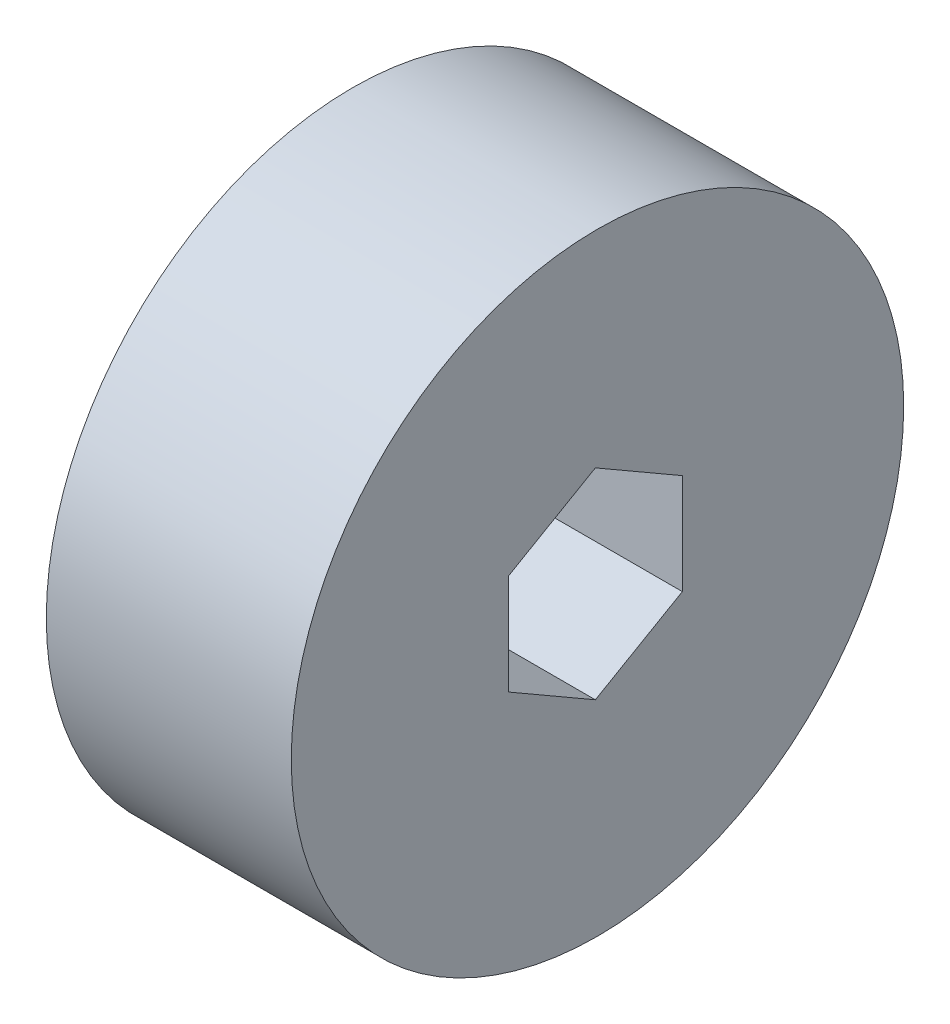
ISO-10303-21;
HEADER;
FILE_DESCRIPTION(('STEP AP214'),'2;1');
FILE_NAME('part.step','',(''),(''),'','','');
FILE_SCHEMA(('AUTOMOTIVE_DESIGN { 1 0 10303 214 1 1 1 1 }'));
ENDSEC;
DATA;
#1=APPLICATION_CONTEXT('core data for automotive mechanical design processes');
#2=APPLICATION_PROTOCOL_DEFINITION('international standard','automotive_design',2000,#1);
#3=PRODUCT_CONTEXT('',#1,'mechanical');
#4=PRODUCT('Part','Part','',(#3));
#5=PRODUCT_RELATED_PRODUCT_CATEGORY('part','',(#4));
#6=PRODUCT_DEFINITION_FORMATION('','',#4);
#7=PRODUCT_DEFINITION_CONTEXT('part definition',#1,'design');
#8=PRODUCT_DEFINITION('design','',#6,#7);
#9=PRODUCT_DEFINITION_SHAPE('','',#8);
#10=(LENGTH_UNIT() NAMED_UNIT(*) SI_UNIT(.MILLI.,.METRE.));
#11=(NAMED_UNIT(*) PLANE_ANGLE_UNIT() SI_UNIT($,.RADIAN.));
#12=(NAMED_UNIT(*) SI_UNIT($,.STERADIAN.) SOLID_ANGLE_UNIT());
#13=UNCERTAINTY_MEASURE_WITH_UNIT(LENGTH_MEASURE(1.E-05),#10,'distance_accuracy_value','');
#14=(GEOMETRIC_REPRESENTATION_CONTEXT(3) GLOBAL_UNCERTAINTY_ASSIGNED_CONTEXT((#13)) GLOBAL_UNIT_ASSIGNED_CONTEXT((#10,
#11,#12)) REPRESENTATION_CONTEXT('',''));
#15=CARTESIAN_POINT('',(0.,0.,0.));
#16=DIRECTION('',(0.,0.,1.));
#17=DIRECTION('',(1.,0.,0.));
#18=AXIS2_PLACEMENT_3D('',#15,#16,#17);
#19=CARTESIAN_POINT('',(5.,0.,0.));
#20=DIRECTION('',(1.,0.,0.));
#21=DIRECTION('',(0.,0.,-1.));
#22=AXIS2_PLACEMENT_3D('',#19,#20,#21);
#23=PLANE('',#22);
#24=CARTESIAN_POINT('',(5.,0.,0.));
#25=DIRECTION('',(1.,0.,0.));
#26=DIRECTION('',(0.,0.,-1.));
#27=AXIS2_PLACEMENT_3D('',#24,#25,#26);
#28=CIRCLE('',#27,12.5);
#29=CARTESIAN_POINT('',(5.,0.,-12.5));
#30=VERTEX_POINT('',#29);
#31=EDGE_CURVE('E11',#30,#30,#28,.T.);
#32=ORIENTED_EDGE('',*,*,#31,.T.);
#33=EDGE_LOOP('',(#32));
#34=FACE_BOUND('',#33,.T.);
#35=DIRECTION('',(0.,0.500000000000001,-0.866025403784438));
#36=VECTOR('',#35,1.);
#37=CARTESIAN_POINT('',(5.,-4.09515334538775,0.086747096681614));
#38=LINE('',#37,#36);
#39=CARTESIAN_POINT('',(5.,-4.09515334538775,0.086747096681614));
#40=VERTEX_POINT('',#39);
#41=CARTESIAN_POINT('',(5.,-2.04555988976458,-3.46325290331838));
#42=VERTEX_POINT('',#41);
#43=EDGE_CURVE('E102',#40,#42,#38,.T.);
#44=ORIENTED_EDGE('',*,*,#43,.F.);
#45=DIRECTION('',(0.,-0.5,-0.866025403784439));
#46=VECTOR('',#45,1.);
#47=CARTESIAN_POINT('',(5.,-2.04555988976458,3.63674709668161));
#48=LINE('',#47,#46);
#49=CARTESIAN_POINT('',(5.,-2.04555988976458,3.63674709668161));
#50=VERTEX_POINT('',#49);
#51=EDGE_CURVE('E93',#50,#40,#48,.T.);
#52=ORIENTED_EDGE('',*,*,#51,.F.);
#53=DIRECTION('',(0.,-1.,0.));
#54=VECTOR('',#53,1.);
#55=CARTESIAN_POINT('',(5.,2.05362702148176,3.63674709668161));
#56=LINE('',#55,#54);
#57=CARTESIAN_POINT('',(5.,2.05362702148176,3.63674709668161));
#58=VERTEX_POINT('',#57);
#59=EDGE_CURVE('E127',#58,#50,#56,.T.);
#60=ORIENTED_EDGE('',*,*,#59,.F.);
#61=DIRECTION('',(0.,-0.500000000000001,0.866025403784438));
#62=VECTOR('',#61,1.);
#63=CARTESIAN_POINT('',(5.,4.10322047710493,0.0867470966816157));
#64=LINE('',#63,#62);
#65=CARTESIAN_POINT('',(5.,4.10322047710493,0.0867470966816157));
#66=VERTEX_POINT('',#65);
#67=EDGE_CURVE('E124',#66,#58,#64,.T.);
#68=ORIENTED_EDGE('',*,*,#67,.F.);
#69=DIRECTION('',(0.,0.5,0.866025403784438));
#70=VECTOR('',#69,1.);
#71=CARTESIAN_POINT('',(5.,2.05362702148176,-3.46325290331838));
#72=LINE('',#71,#70);
#73=CARTESIAN_POINT('',(5.,2.05362702148176,-3.46325290331838));
#74=VERTEX_POINT('',#73);
#75=EDGE_CURVE('E119',#74,#66,#72,.T.);
#76=ORIENTED_EDGE('',*,*,#75,.F.);
#77=DIRECTION('',(0.,1.,0.));
#78=VECTOR('',#77,1.);
#79=CARTESIAN_POINT('',(5.,-2.04555988976458,-3.46325290331838));
#80=LINE('',#79,#78);
#81=EDGE_CURVE('E115',#42,#74,#80,.T.);
#82=ORIENTED_EDGE('',*,*,#81,.F.);
#83=EDGE_LOOP('',(#44,#52,#60,#68,#76,#82));
#84=FACE_BOUND('',#83,.T.);
#85=ADVANCED_FACE('F39',(#34,#84),#23,.T.);
#86=CARTESIAN_POINT('',(-5.,0.,0.));
#87=DIRECTION('',(1.,0.,0.));
#88=DIRECTION('',(0.,0.,-1.));
#89=AXIS2_PLACEMENT_3D('',#86,#87,#88);
#90=PLANE('',#89);
#91=CARTESIAN_POINT('',(-5.,0.,0.));
#92=DIRECTION('',(1.,0.,0.));
#93=DIRECTION('',(0.,0.,-1.));
#94=AXIS2_PLACEMENT_3D('',#91,#92,#93);
#95=CIRCLE('',#94,12.5);
#96=CARTESIAN_POINT('',(-5.,0.,-12.5));
#97=VERTEX_POINT('',#96);
#98=EDGE_CURVE('E43',#97,#97,#95,.T.);
#99=ORIENTED_EDGE('',*,*,#98,.F.);
#100=EDGE_LOOP('',(#99));
#101=FACE_BOUND('',#100,.T.);
#102=DIRECTION('',(0.,-0.5,-0.866025403784439));
#103=VECTOR('',#102,1.);
#104=CARTESIAN_POINT('',(-5.,-2.04555988976458,3.63674709668161));
#105=LINE('',#104,#103);
#106=CARTESIAN_POINT('',(-5.,-2.04555988976458,3.63674709668161));
#107=VERTEX_POINT('',#106);
#108=CARTESIAN_POINT('',(-5.,-4.09515334538775,0.086747096681614));
#109=VERTEX_POINT('',#108);
#110=EDGE_CURVE('E63',#107,#109,#105,.T.);
#111=ORIENTED_EDGE('',*,*,#110,.T.);
#112=DIRECTION('',(0.,0.500000000000001,-0.866025403784438));
#113=VECTOR('',#112,1.);
#114=CARTESIAN_POINT('',(-5.,-4.09515334538775,0.086747096681614));
#115=LINE('',#114,#113);
#116=CARTESIAN_POINT('',(-5.,-2.04555988976458,-3.46325290331838));
#117=VERTEX_POINT('',#116);
#118=EDGE_CURVE('E109',#109,#117,#115,.T.);
#119=ORIENTED_EDGE('',*,*,#118,.T.);
#120=DIRECTION('',(0.,1.,0.));
#121=VECTOR('',#120,1.);
#122=CARTESIAN_POINT('',(-5.,-2.04555988976458,-3.46325290331838));
#123=LINE('',#122,#121);
#124=CARTESIAN_POINT('',(-5.,2.05362702148176,-3.46325290331838));
#125=VERTEX_POINT('',#124);
#126=EDGE_CURVE('E134',#117,#125,#123,.T.);
#127=ORIENTED_EDGE('',*,*,#126,.T.);
#128=DIRECTION('',(0.,0.5,0.866025403784438));
#129=VECTOR('',#128,1.);
#130=CARTESIAN_POINT('',(-5.,2.05362702148176,-3.46325290331838));
#131=LINE('',#130,#129);
#132=CARTESIAN_POINT('',(-5.,4.10322047710493,0.0867470966816157));
#133=VERTEX_POINT('',#132);
#134=EDGE_CURVE('E138',#125,#133,#131,.T.);
#135=ORIENTED_EDGE('',*,*,#134,.T.);
#136=DIRECTION('',(0.,-0.500000000000001,0.866025403784438));
#137=VECTOR('',#136,1.);
#138=CARTESIAN_POINT('',(-5.,4.10322047710493,0.0867470966816157));
#139=LINE('',#138,#137);
#140=CARTESIAN_POINT('',(-5.,2.05362702148176,3.63674709668161));
#141=VERTEX_POINT('',#140);
#142=EDGE_CURVE('E142',#133,#141,#139,.T.);
#143=ORIENTED_EDGE('',*,*,#142,.T.);
#144=DIRECTION('',(0.,-1.,0.));
#145=VECTOR('',#144,1.);
#146=CARTESIAN_POINT('',(-5.,2.05362702148176,3.63674709668161));
#147=LINE('',#146,#145);
#148=EDGE_CURVE('E103',#141,#107,#147,.T.);
#149=ORIENTED_EDGE('',*,*,#148,.T.);
#150=EDGE_LOOP('',(#111,#119,#127,#135,#143,#149));
#151=FACE_BOUND('',#150,.T.);
#152=ADVANCED_FACE('F166',(#101,#151),#90,.F.);
#153=CARTESIAN_POINT('',(5.,0.,0.));
#154=DIRECTION('',(-1.,0.,0.));
#155=DIRECTION('',(0.,0.,1.));
#156=AXIS2_PLACEMENT_3D('',#153,#154,#155);
#157=CYLINDRICAL_SURFACE('',#156,12.5);
#158=ORIENTED_EDGE('',*,*,#31,.F.);
#159=EDGE_LOOP('',(#158));
#160=FACE_BOUND('',#159,.T.);
#161=ORIENTED_EDGE('',*,*,#98,.T.);
#162=EDGE_LOOP('',(#161));
#163=FACE_BOUND('',#162,.T.);
#164=ADVANCED_FACE('F41',(#160,#163),#157,.T.);
#165=CARTESIAN_POINT('',(5.,-2.04555988976458,3.63674709668161));
#166=DIRECTION('',(0.,0.866025403784439,-0.5));
#167=DIRECTION('',(0.,0.5,0.866025403784439));
#168=AXIS2_PLACEMENT_3D('',#165,#166,#167);
#169=PLANE('',#168);
#170=ORIENTED_EDGE('',*,*,#110,.F.);
#171=DIRECTION('',(-1.,0.,0.));
#172=VECTOR('',#171,1.);
#173=CARTESIAN_POINT('',(5.,-2.04555988976458,3.63674709668161));
#174=LINE('',#173,#172);
#175=EDGE_CURVE('E97',#50,#107,#174,.T.);
#176=ORIENTED_EDGE('',*,*,#175,.F.);
#177=ORIENTED_EDGE('',*,*,#51,.T.);
#178=DIRECTION('',(-1.,0.,0.));
#179=VECTOR('',#178,1.);
#180=CARTESIAN_POINT('',(5.,-4.09515334538775,0.086747096681614));
#181=LINE('',#180,#179);
#182=EDGE_CURVE('E96',#40,#109,#181,.T.);
#183=ORIENTED_EDGE('',*,*,#182,.T.);
#184=EDGE_LOOP('',(#170,#176,#177,#183));
#185=FACE_BOUND('',#184,.T.);
#186=ADVANCED_FACE('F95',(#185),#169,.T.);
#187=CARTESIAN_POINT('',(5.,-4.09515334538775,0.086747096681614));
#188=DIRECTION('',(0.,0.866025403784438,0.500000000000001));
#189=DIRECTION('',(0.,-0.500000000000001,0.866025403784438));
#190=AXIS2_PLACEMENT_3D('',#187,#188,#189);
#191=PLANE('',#190);
#192=ORIENTED_EDGE('',*,*,#118,.F.);
#193=ORIENTED_EDGE('',*,*,#182,.F.);
#194=ORIENTED_EDGE('',*,*,#43,.T.);
#195=DIRECTION('',(-1.,0.,0.));
#196=VECTOR('',#195,1.);
#197=CARTESIAN_POINT('',(5.,-2.04555988976458,-3.46325290331838));
#198=LINE('',#197,#196);
#199=EDGE_CURVE('E111',#42,#117,#198,.T.);
#200=ORIENTED_EDGE('',*,*,#199,.T.);
#201=EDGE_LOOP('',(#192,#193,#194,#200));
#202=FACE_BOUND('',#201,.T.);
#203=ADVANCED_FACE('F106',(#202),#191,.T.);
#204=CARTESIAN_POINT('',(5.,-2.04555988976458,-3.46325290331838));
#205=DIRECTION('',(0.,0.,1.));
#206=DIRECTION('',(0.,-1.,0.));
#207=AXIS2_PLACEMENT_3D('',#204,#205,#206);
#208=PLANE('',#207);
#209=ORIENTED_EDGE('',*,*,#126,.F.);
#210=ORIENTED_EDGE('',*,*,#199,.F.);
#211=ORIENTED_EDGE('',*,*,#81,.T.);
#212=DIRECTION('',(-1.,0.,0.));
#213=VECTOR('',#212,1.);
#214=CARTESIAN_POINT('',(5.,2.05362702148176,-3.46325290331838));
#215=LINE('',#214,#213);
#216=EDGE_CURVE('E156',#74,#125,#215,.T.);
#217=ORIENTED_EDGE('',*,*,#216,.T.);
#218=EDGE_LOOP('',(#209,#210,#211,#217));
#219=FACE_BOUND('',#218,.T.);
#220=ADVANCED_FACE('F162',(#219),#208,.T.);
#221=CARTESIAN_POINT('',(5.,2.05362702148176,-3.46325290331838));
#222=DIRECTION('',(0.,-0.866025403784438,0.5));
#223=DIRECTION('',(0.,-0.5,-0.866025403784438));
#224=AXIS2_PLACEMENT_3D('',#221,#222,#223);
#225=PLANE('',#224);
#226=ORIENTED_EDGE('',*,*,#134,.F.);
#227=ORIENTED_EDGE('',*,*,#216,.F.);
#228=ORIENTED_EDGE('',*,*,#75,.T.);
#229=DIRECTION('',(-1.,0.,0.));
#230=VECTOR('',#229,1.);
#231=CARTESIAN_POINT('',(5.,4.10322047710493,0.0867470966816157));
#232=LINE('',#231,#230);
#233=EDGE_CURVE('E153',#66,#133,#232,.T.);
#234=ORIENTED_EDGE('',*,*,#233,.T.);
#235=EDGE_LOOP('',(#226,#227,#228,#234));
#236=FACE_BOUND('',#235,.T.);
#237=ADVANCED_FACE('F174',(#236),#225,.T.);
#238=CARTESIAN_POINT('',(5.,4.10322047710493,0.0867470966816157));
#239=DIRECTION('',(0.,-0.866025403784438,-0.500000000000001));
#240=DIRECTION('',(0.,0.500000000000001,-0.866025403784438));
#241=AXIS2_PLACEMENT_3D('',#238,#239,#240);
#242=PLANE('',#241);
#243=ORIENTED_EDGE('',*,*,#142,.F.);
#244=ORIENTED_EDGE('',*,*,#233,.F.);
#245=ORIENTED_EDGE('',*,*,#67,.T.);
#246=DIRECTION('',(-1.,0.,0.));
#247=VECTOR('',#246,1.);
#248=CARTESIAN_POINT('',(5.,2.05362702148176,3.63674709668161));
#249=LINE('',#248,#247);
#250=EDGE_CURVE('E55',#58,#141,#249,.T.);
#251=ORIENTED_EDGE('',*,*,#250,.T.);
#252=EDGE_LOOP('',(#243,#244,#245,#251));
#253=FACE_BOUND('',#252,.T.);
#254=ADVANCED_FACE('F172',(#253),#242,.T.);
#255=CARTESIAN_POINT('',(5.,2.05362702148176,3.63674709668161));
#256=DIRECTION('',(0.,0.,-1.));
#257=DIRECTION('',(-1.,0.,0.));
#258=AXIS2_PLACEMENT_3D('',#255,#256,#257);
#259=PLANE('',#258);
#260=ORIENTED_EDGE('',*,*,#148,.F.);
#261=ORIENTED_EDGE('',*,*,#250,.F.);
#262=ORIENTED_EDGE('',*,*,#59,.T.);
#263=ORIENTED_EDGE('',*,*,#175,.T.);
#264=EDGE_LOOP('',(#260,#261,#262,#263));
#265=FACE_BOUND('',#264,.T.);
#266=ADVANCED_FACE('F168',(#265),#259,.T.);
#267=CLOSED_SHELL('',(#85,#152,#164,#186,#203,#220,#237,#254,#266));
#268=MANIFOLD_SOLID_BREP('B2',#267);
#269=ADVANCED_BREP_SHAPE_REPRESENTATION('',(#18,#268),#14);
#270=SHAPE_DEFINITION_REPRESENTATION(#9,#269);
ENDSEC;
END-ISO-10303-21;
